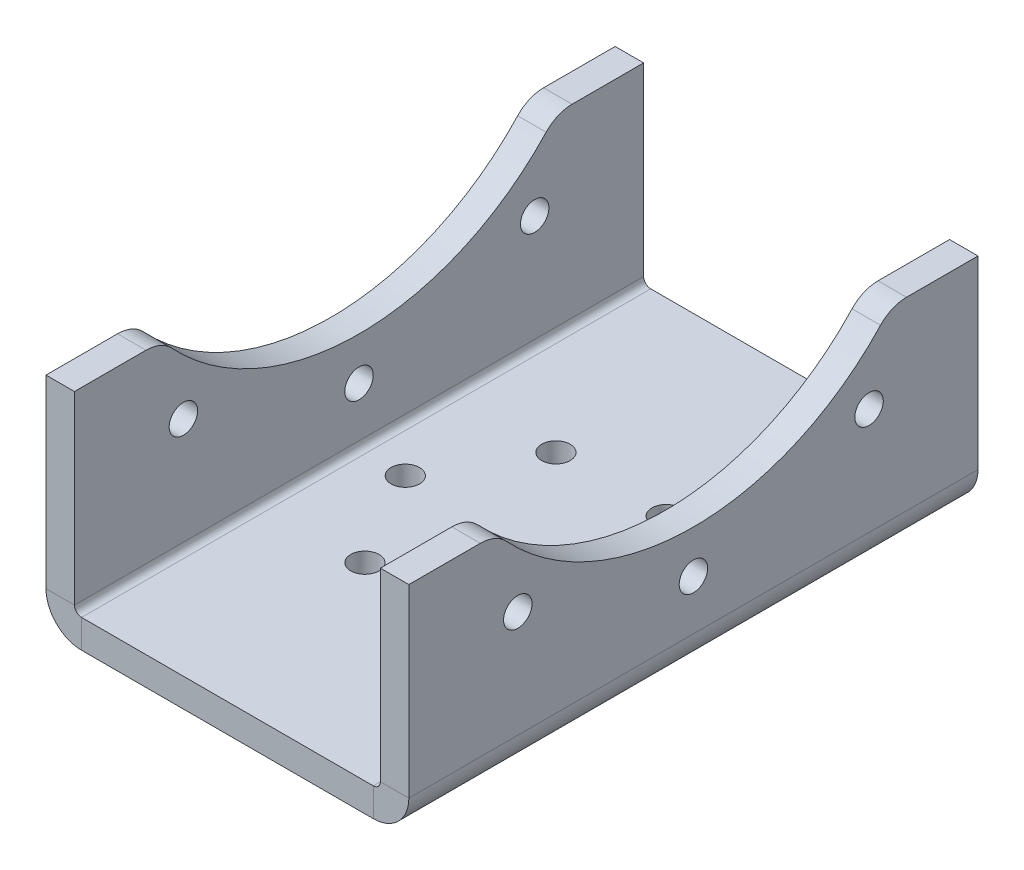
ISO-10303-21;
HEADER;
FILE_DESCRIPTION(('STEP AP214'),'2;1');
FILE_NAME('part.step','',(''),(''),'','','');
FILE_SCHEMA(('AUTOMOTIVE_DESIGN { 1 0 10303 214 1 1 1 1 }'));
ENDSEC;
DATA;
#1=APPLICATION_CONTEXT('core data for automotive mechanical design processes');
#2=APPLICATION_PROTOCOL_DEFINITION('international standard','automotive_design',2000,#1);
#3=PRODUCT_CONTEXT('',#1,'mechanical');
#4=PRODUCT('Part','Part','',(#3));
#5=PRODUCT_RELATED_PRODUCT_CATEGORY('part','',(#4));
#6=PRODUCT_DEFINITION_FORMATION('','',#4);
#7=PRODUCT_DEFINITION_CONTEXT('part definition',#1,'design');
#8=PRODUCT_DEFINITION('design','',#6,#7);
#9=PRODUCT_DEFINITION_SHAPE('','',#8);
#10=(LENGTH_UNIT() NAMED_UNIT(*) SI_UNIT(.MILLI.,.METRE.));
#11=(NAMED_UNIT(*) PLANE_ANGLE_UNIT() SI_UNIT($,.RADIAN.));
#12=(NAMED_UNIT(*) SI_UNIT($,.STERADIAN.) SOLID_ANGLE_UNIT());
#13=UNCERTAINTY_MEASURE_WITH_UNIT(LENGTH_MEASURE(1.E-05),#10,'distance_accuracy_value','');
#14=(GEOMETRIC_REPRESENTATION_CONTEXT(3) GLOBAL_UNCERTAINTY_ASSIGNED_CONTEXT((#13)) GLOBAL_UNIT_ASSIGNED_CONTEXT((#10,
#11,#12)) REPRESENTATION_CONTEXT('',''));
#15=CARTESIAN_POINT('',(0.,0.,0.));
#16=DIRECTION('',(0.,0.,1.));
#17=DIRECTION('',(1.,0.,0.));
#18=AXIS2_PLACEMENT_3D('',#15,#16,#17);
#19=CARTESIAN_POINT('',(-25.5,27.,80.));
#20=DIRECTION('',(0.,1.,0.));
#21=DIRECTION('',(0.,0.,1.));
#22=AXIS2_PLACEMENT_3D('',#19,#20,#21);
#23=PLANE('',#22);
#24=DIRECTION('',(0.,0.,-1.));
#25=VECTOR('',#24,1.);
#26=CARTESIAN_POINT('',(-25.5,27.,80.));
#27=LINE('',#26,#25);
#28=CARTESIAN_POINT('',(-25.5,27.,10.0500417362561));
#29=VERTEX_POINT('',#28);
#30=CARTESIAN_POINT('',(-25.5,27.,0.));
#31=VERTEX_POINT('',#30);
#32=EDGE_CURVE('E298',#29,#31,#27,.T.);
#33=ORIENTED_EDGE('',*,*,#32,.F.);
#34=DIRECTION('',(1.,0.,0.));
#35=VECTOR('',#34,1.);
#36=CARTESIAN_POINT('',(-21.5,27.,10.0500417362561));
#37=LINE('',#36,#35);
#38=CARTESIAN_POINT('',(-21.5,27.,10.0500417362561));
#39=VERTEX_POINT('',#38);
#40=EDGE_CURVE('E344',#29,#39,#37,.T.);
#41=ORIENTED_EDGE('',*,*,#40,.T.);
#42=DIRECTION('',(0.,0.,-1.));
#43=VECTOR('',#42,1.);
#44=CARTESIAN_POINT('',(-21.5,27.,80.));
#45=LINE('',#44,#43);
#46=CARTESIAN_POINT('',(-21.5,27.,0.));
#47=VERTEX_POINT('',#46);
#48=EDGE_CURVE('E196',#39,#47,#45,.T.);
#49=ORIENTED_EDGE('',*,*,#48,.T.);
#50=DIRECTION('',(1.,0.,0.));
#51=VECTOR('',#50,1.);
#52=CARTESIAN_POINT('',(-25.5,27.,0.));
#53=LINE('',#52,#51);
#54=EDGE_CURVE('E236',#31,#47,#53,.T.);
#55=ORIENTED_EDGE('',*,*,#54,.F.);
#56=EDGE_LOOP('',(#33,#41,#49,#55));
#57=FACE_BOUND('',#56,.T.);
#58=ADVANCED_FACE('F36',(#57),#23,.T.);
#59=CARTESIAN_POINT('',(21.5,27.,80.));
#60=DIRECTION('',(0.,1.,0.));
#61=DIRECTION('',(0.,0.,1.));
#62=AXIS2_PLACEMENT_3D('',#59,#60,#61);
#63=PLANE('',#62);
#64=DIRECTION('',(0.,0.,-1.));
#65=VECTOR('',#64,1.);
#66=CARTESIAN_POINT('',(21.5,27.,80.));
#67=LINE('',#66,#65);
#68=CARTESIAN_POINT('',(21.5,27.,10.0500417362561));
#69=VERTEX_POINT('',#68);
#70=CARTESIAN_POINT('',(21.5,27.,0.));
#71=VERTEX_POINT('',#70);
#72=EDGE_CURVE('E279',#69,#71,#67,.T.);
#73=ORIENTED_EDGE('',*,*,#72,.F.);
#74=DIRECTION('',(1.,0.,0.));
#75=VECTOR('',#74,1.);
#76=CARTESIAN_POINT('',(25.5,27.,10.0500417362561));
#77=LINE('',#76,#75);
#78=CARTESIAN_POINT('',(25.5,27.,10.0500417362561));
#79=VERTEX_POINT('',#78);
#80=EDGE_CURVE('E61',#69,#79,#77,.T.);
#81=ORIENTED_EDGE('',*,*,#80,.T.);
#82=DIRECTION('',(0.,0.,-1.));
#83=VECTOR('',#82,1.);
#84=CARTESIAN_POINT('',(25.5,27.,80.));
#85=LINE('',#84,#83);
#86=CARTESIAN_POINT('',(25.5,27.,0.));
#87=VERTEX_POINT('',#86);
#88=EDGE_CURVE('E283',#79,#87,#85,.T.);
#89=ORIENTED_EDGE('',*,*,#88,.T.);
#90=DIRECTION('',(1.,0.,0.));
#91=VECTOR('',#90,1.);
#92=CARTESIAN_POINT('',(21.5,27.,0.));
#93=LINE('',#92,#91);
#94=EDGE_CURVE('E255',#71,#87,#93,.T.);
#95=ORIENTED_EDGE('',*,*,#94,.F.);
#96=EDGE_LOOP('',(#73,#81,#89,#95));
#97=FACE_BOUND('',#96,.T.);
#98=ADVANCED_FACE('F426',(#97),#63,.T.);
#99=CARTESIAN_POINT('',(21.5,1.00000000000001,80.));
#100=DIRECTION('',(0.,0.,1.));
#101=DIRECTION('',(1.,0.,0.));
#102=AXIS2_PLACEMENT_3D('',#99,#100,#101);
#103=PLANE('',#102);
#104=DIRECTION('',(1.,0.,0.));
#105=VECTOR('',#104,1.);
#106=CARTESIAN_POINT('',(21.5,1.00000000000001,80.));
#107=LINE('',#106,#105);
#108=CARTESIAN_POINT('',(21.5,1.00000000000001,80.));
#109=VERTEX_POINT('',#108);
#110=CARTESIAN_POINT('',(25.5,1.00000000000001,80.));
#111=VERTEX_POINT('',#110);
#112=EDGE_CURVE('E312',#109,#111,#107,.T.);
#113=ORIENTED_EDGE('',*,*,#112,.F.);
#114=CARTESIAN_POINT('',(20.5,1.00000000000001,80.));
#115=DIRECTION('',(0.,0.,1.));
#116=DIRECTION('',(1.,0.,0.));
#117=AXIS2_PLACEMENT_3D('',#114,#115,#116);
#118=CIRCLE('',#117,1.);
#119=CARTESIAN_POINT('',(20.5,0.,80.));
#120=VERTEX_POINT('',#119);
#121=EDGE_CURVE('E224',#109,#120,#118,.F.);
#122=ORIENTED_EDGE('',*,*,#121,.T.);
#123=DIRECTION('',(0.,1.,0.));
#124=VECTOR('',#123,1.);
#125=CARTESIAN_POINT('',(20.5,-3.99999999999999,80.));
#126=LINE('',#125,#124);
#127=CARTESIAN_POINT('',(20.5,-3.99999999999999,80.));
#128=VERTEX_POINT('',#127);
#129=EDGE_CURVE('E310',#128,#120,#126,.T.);
#130=ORIENTED_EDGE('',*,*,#129,.F.);
#131=CARTESIAN_POINT('',(20.5,1.00000000000001,80.));
#132=DIRECTION('',(0.,0.,1.));
#133=DIRECTION('',(1.,0.,0.));
#134=AXIS2_PLACEMENT_3D('',#131,#132,#133);
#135=CIRCLE('',#134,5.);
#136=EDGE_CURVE('E212',#111,#128,#135,.F.);
#137=ORIENTED_EDGE('',*,*,#136,.F.);
#138=EDGE_LOOP('',(#113,#122,#130,#137));
#139=FACE_BOUND('',#138,.T.);
#140=ADVANCED_FACE('F432',(#139),#103,.T.);
#141=CARTESIAN_POINT('',(20.5,-3.99999999999999,80.));
#142=DIRECTION('',(0.,0.,1.));
#143=DIRECTION('',(1.,0.,0.));
#144=AXIS2_PLACEMENT_3D('',#141,#142,#143);
#145=PLANE('',#144);
#146=DIRECTION('',(0.,-1.,0.));
#147=VECTOR('',#146,1.);
#148=CARTESIAN_POINT('',(21.5,0.,80.));
#149=LINE('',#148,#147);
#150=CARTESIAN_POINT('',(21.5,27.,80.));
#151=VERTEX_POINT('',#150);
#152=EDGE_CURVE('E221',#151,#109,#149,.T.);
#153=ORIENTED_EDGE('',*,*,#152,.T.);
#154=ORIENTED_EDGE('',*,*,#112,.T.);
#155=DIRECTION('',(0.,1.,0.));
#156=VECTOR('',#155,1.);
#157=CARTESIAN_POINT('',(25.5,0.,80.));
#158=LINE('',#157,#156);
#159=CARTESIAN_POINT('',(25.5,27.,80.));
#160=VERTEX_POINT('',#159);
#161=EDGE_CURVE('E215',#160,#111,#158,.F.);
#162=ORIENTED_EDGE('',*,*,#161,.F.);
#163=DIRECTION('',(1.,0.,0.));
#164=VECTOR('',#163,1.);
#165=CARTESIAN_POINT('',(21.5,27.,80.));
#166=LINE('',#165,#164);
#167=EDGE_CURVE('E218',#151,#160,#166,.T.);
#168=ORIENTED_EDGE('',*,*,#167,.F.);
#169=EDGE_LOOP('',(#153,#154,#162,#168));
#170=FACE_BOUND('',#169,.T.);
#171=ADVANCED_FACE('F472',(#170),#145,.T.);
#172=CARTESIAN_POINT('',(20.5,0.,0.));
#173=DIRECTION('',(0.,0.,-1.));
#174=DIRECTION('',(-1.,0.,0.));
#175=AXIS2_PLACEMENT_3D('',#172,#173,#174);
#176=PLANE('',#175);
#177=DIRECTION('',(0.,-1.,0.));
#178=VECTOR('',#177,1.);
#179=CARTESIAN_POINT('',(20.5,0.,0.));
#180=LINE('',#179,#178);
#181=CARTESIAN_POINT('',(20.5,0.,0.));
#182=VERTEX_POINT('',#181);
#183=CARTESIAN_POINT('',(20.5,-3.99999999999999,0.));
#184=VERTEX_POINT('',#183);
#185=EDGE_CURVE('E308',#182,#184,#180,.T.);
#186=ORIENTED_EDGE('',*,*,#185,.F.);
#187=CARTESIAN_POINT('',(20.5,1.00000000000001,0.));
#188=DIRECTION('',(0.,0.,1.));
#189=DIRECTION('',(1.,0.,0.));
#190=AXIS2_PLACEMENT_3D('',#187,#188,#189);
#191=CIRCLE('',#190,1.);
#192=CARTESIAN_POINT('',(21.5,1.00000000000001,0.));
#193=VERTEX_POINT('',#192);
#194=EDGE_CURVE('E261',#193,#182,#191,.F.);
#195=ORIENTED_EDGE('',*,*,#194,.F.);
#196=DIRECTION('',(-1.,0.,0.));
#197=VECTOR('',#196,1.);
#198=CARTESIAN_POINT('',(25.5,1.00000000000001,0.));
#199=LINE('',#198,#197);
#200=CARTESIAN_POINT('',(25.5,1.00000000000001,0.));
#201=VERTEX_POINT('',#200);
#202=EDGE_CURVE('E306',#201,#193,#199,.T.);
#203=ORIENTED_EDGE('',*,*,#202,.F.);
#204=CARTESIAN_POINT('',(20.5,1.00000000000001,0.));
#205=DIRECTION('',(0.,0.,1.));
#206=DIRECTION('',(1.,0.,0.));
#207=AXIS2_PLACEMENT_3D('',#204,#205,#206);
#208=CIRCLE('',#207,5.);
#209=EDGE_CURVE('E249',#201,#184,#208,.F.);
#210=ORIENTED_EDGE('',*,*,#209,.T.);
#211=EDGE_LOOP('',(#186,#195,#203,#210));
#212=FACE_BOUND('',#211,.T.);
#213=ADVANCED_FACE('F468',(#212),#176,.T.);
#214=CARTESIAN_POINT('',(25.5,1.00000000000001,0.));
#215=DIRECTION('',(0.,0.,-1.));
#216=DIRECTION('',(-1.,0.,0.));
#217=AXIS2_PLACEMENT_3D('',#214,#215,#216);
#218=PLANE('',#217);
#219=DIRECTION('',(-1.,0.,0.));
#220=VECTOR('',#219,1.);
#221=CARTESIAN_POINT('',(-21.5,0.,0.));
#222=LINE('',#221,#220);
#223=CARTESIAN_POINT('',(-20.5,0.,0.));
#224=VERTEX_POINT('',#223);
#225=EDGE_CURVE('E264',#182,#224,#222,.T.);
#226=ORIENTED_EDGE('',*,*,#225,.F.);
#227=ORIENTED_EDGE('',*,*,#185,.T.);
#228=DIRECTION('',(-1.,0.,0.));
#229=VECTOR('',#228,1.);
#230=CARTESIAN_POINT('',(-21.5,-4.,0.));
#231=LINE('',#230,#229);
#232=CARTESIAN_POINT('',(-20.5,-4.,0.));
#233=VERTEX_POINT('',#232);
#234=EDGE_CURVE('E246',#184,#233,#231,.T.);
#235=ORIENTED_EDGE('',*,*,#234,.T.);
#236=DIRECTION('',(0.,1.,0.));
#237=VECTOR('',#236,1.);
#238=CARTESIAN_POINT('',(-20.5,-4.,0.));
#239=LINE('',#238,#237);
#240=EDGE_CURVE('E195',#233,#224,#239,.T.);
#241=ORIENTED_EDGE('',*,*,#240,.T.);
#242=EDGE_LOOP('',(#226,#227,#235,#241));
#243=FACE_BOUND('',#242,.T.);
#244=ADVANCED_FACE('F464',(#243),#218,.T.);
#245=CARTESIAN_POINT('',(-20.5,0.,80.));
#246=DIRECTION('',(0.,0.,1.));
#247=DIRECTION('',(1.,0.,0.));
#248=AXIS2_PLACEMENT_3D('',#245,#246,#247);
#249=PLANE('',#248);
#250=DIRECTION('',(0.,-1.,0.));
#251=VECTOR('',#250,1.);
#252=CARTESIAN_POINT('',(-20.5,0.,80.));
#253=LINE('',#252,#251);
#254=CARTESIAN_POINT('',(-20.5,0.,80.));
#255=VERTEX_POINT('',#254);
#256=CARTESIAN_POINT('',(-20.5,-4.,80.));
#257=VERTEX_POINT('',#256);
#258=EDGE_CURVE('E304',#255,#257,#253,.T.);
#259=ORIENTED_EDGE('',*,*,#258,.F.);
#260=CARTESIAN_POINT('',(-20.5,1.,80.));
#261=DIRECTION('',(0.,0.,1.));
#262=DIRECTION('',(1.,0.,0.));
#263=AXIS2_PLACEMENT_3D('',#260,#261,#262);
#264=CIRCLE('',#263,1.);
#265=CARTESIAN_POINT('',(-21.5,1.,80.));
#266=VERTEX_POINT('',#265);
#267=EDGE_CURVE('E230',#255,#266,#264,.F.);
#268=ORIENTED_EDGE('',*,*,#267,.T.);
#269=DIRECTION('',(1.,0.,0.));
#270=VECTOR('',#269,1.);
#271=CARTESIAN_POINT('',(-25.5,1.,80.));
#272=LINE('',#271,#270);
#273=CARTESIAN_POINT('',(-25.5,1.,80.));
#274=VERTEX_POINT('',#273);
#275=EDGE_CURVE('E182',#274,#266,#272,.T.);
#276=ORIENTED_EDGE('',*,*,#275,.F.);
#277=CARTESIAN_POINT('',(-20.5,1.,80.));
#278=DIRECTION('',(0.,0.,1.));
#279=DIRECTION('',(1.,0.,0.));
#280=AXIS2_PLACEMENT_3D('',#277,#278,#279);
#281=CIRCLE('',#280,5.);
#282=EDGE_CURVE('E203',#257,#274,#281,.F.);
#283=ORIENTED_EDGE('',*,*,#282,.F.);
#284=EDGE_LOOP('',(#259,#268,#276,#283));
#285=FACE_BOUND('',#284,.T.);
#286=ADVANCED_FACE('F460',(#285),#249,.T.);
#287=CARTESIAN_POINT('',(-25.5,1.,80.));
#288=DIRECTION('',(0.,0.,1.));
#289=DIRECTION('',(1.,0.,0.));
#290=AXIS2_PLACEMENT_3D('',#287,#288,#289);
#291=PLANE('',#290);
#292=DIRECTION('',(-1.,0.,0.));
#293=VECTOR('',#292,1.);
#294=CARTESIAN_POINT('',(-21.5,0.,80.));
#295=LINE('',#294,#293);
#296=EDGE_CURVE('E227',#120,#255,#295,.T.);
#297=ORIENTED_EDGE('',*,*,#296,.T.);
#298=ORIENTED_EDGE('',*,*,#258,.T.);
#299=DIRECTION('',(-1.,0.,0.));
#300=VECTOR('',#299,1.);
#301=CARTESIAN_POINT('',(-21.5,-4.,80.));
#302=LINE('',#301,#300);
#303=EDGE_CURVE('E209',#128,#257,#302,.T.);
#304=ORIENTED_EDGE('',*,*,#303,.F.);
#305=ORIENTED_EDGE('',*,*,#129,.T.);
#306=EDGE_LOOP('',(#297,#298,#304,#305));
#307=FACE_BOUND('',#306,.T.);
#308=ADVANCED_FACE('F456',(#307),#291,.T.);
#309=CARTESIAN_POINT('',(-21.5,1.,0.));
#310=DIRECTION('',(0.,0.,-1.));
#311=DIRECTION('',(-1.,0.,0.));
#312=AXIS2_PLACEMENT_3D('',#309,#310,#311);
#313=PLANE('',#312);
#314=DIRECTION('',(-1.,0.,0.));
#315=VECTOR('',#314,1.);
#316=CARTESIAN_POINT('',(-21.5,1.,0.));
#317=LINE('',#316,#315);
#318=CARTESIAN_POINT('',(-21.5,1.,0.));
#319=VERTEX_POINT('',#318);
#320=CARTESIAN_POINT('',(-25.5,1.,0.));
#321=VERTEX_POINT('',#320);
#322=EDGE_CURVE('E301',#319,#321,#317,.T.);
#323=ORIENTED_EDGE('',*,*,#322,.F.);
#324=CARTESIAN_POINT('',(-20.5,1.,0.));
#325=DIRECTION('',(0.,0.,1.));
#326=DIRECTION('',(1.,0.,0.));
#327=AXIS2_PLACEMENT_3D('',#324,#325,#326);
#328=CIRCLE('',#327,1.);
#329=EDGE_CURVE('E186',#224,#319,#328,.F.);
#330=ORIENTED_EDGE('',*,*,#329,.F.);
#331=ORIENTED_EDGE('',*,*,#240,.F.);
#332=CARTESIAN_POINT('',(-20.5,1.,0.));
#333=DIRECTION('',(0.,0.,1.));
#334=DIRECTION('',(1.,0.,0.));
#335=AXIS2_PLACEMENT_3D('',#332,#333,#334);
#336=CIRCLE('',#335,5.);
#337=EDGE_CURVE('E243',#233,#321,#336,.F.);
#338=ORIENTED_EDGE('',*,*,#337,.T.);
#339=EDGE_LOOP('',(#323,#330,#331,#338));
#340=FACE_BOUND('',#339,.T.);
#341=ADVANCED_FACE('F450',(#340),#313,.T.);
#342=CARTESIAN_POINT('',(-20.5,-4.,0.));
#343=DIRECTION('',(0.,0.,-1.));
#344=DIRECTION('',(-1.,0.,0.));
#345=AXIS2_PLACEMENT_3D('',#342,#343,#344);
#346=PLANE('',#345);
#347=DIRECTION('',(0.,1.,0.));
#348=VECTOR('',#347,1.);
#349=CARTESIAN_POINT('',(-21.5,0.,0.));
#350=LINE('',#349,#348);
#351=EDGE_CURVE('E233',#319,#47,#350,.T.);
#352=ORIENTED_EDGE('',*,*,#351,.F.);
#353=ORIENTED_EDGE('',*,*,#322,.T.);
#354=DIRECTION('',(0.,1.,0.));
#355=VECTOR('',#354,1.);
#356=CARTESIAN_POINT('',(-25.5,0.,0.));
#357=LINE('',#356,#355);
#358=EDGE_CURVE('E240',#321,#31,#357,.T.);
#359=ORIENTED_EDGE('',*,*,#358,.T.);
#360=ORIENTED_EDGE('',*,*,#54,.T.);
#361=EDGE_LOOP('',(#352,#353,#359,#360));
#362=FACE_BOUND('',#361,.T.);
#363=ADVANCED_FACE('F446',(#362),#346,.T.);
#364=CARTESIAN_POINT('',(-21.5,0.,80.));
#365=DIRECTION('',(-1.,0.,0.));
#366=DIRECTION('',(0.,0.,1.));
#367=AXIS2_PLACEMENT_3D('',#364,#365,#366);
#368=PLANE('',#367);
#369=CARTESIAN_POINT('',(-21.5,16.0212862362522,64.6869805962839));
#370=DIRECTION('',(-1.,0.,0.));
#371=DIRECTION('',(0.,0.,1.));
#372=AXIS2_PLACEMENT_3D('',#369,#370,#371);
#373=CIRCLE('',#372,2.);
#374=CARTESIAN_POINT('',(-21.5,16.0212862362522,66.6869805962839));
#375=VERTEX_POINT('',#374);
#376=EDGE_CURVE('E237',#375,#375,#373,.T.);
#377=ORIENTED_EDGE('',*,*,#376,.T.);
#378=EDGE_LOOP('',(#377));
#379=FACE_BOUND('',#378,.T.);
#380=CARTESIAN_POINT('',(-21.5,16.0212862362522,15.3130194037161));
#381=DIRECTION('',(-1.,0.,0.));
#382=DIRECTION('',(0.,0.,1.));
#383=AXIS2_PLACEMENT_3D('',#380,#381,#382);
#384=CIRCLE('',#383,2.00000000000002);
#385=CARTESIAN_POINT('',(-21.5,16.0212862362522,17.3130194037162));
#386=VERTEX_POINT('',#385);
#387=EDGE_CURVE('E326',#386,#386,#384,.T.);
#388=ORIENTED_EDGE('',*,*,#387,.T.);
#389=EDGE_LOOP('',(#388));
#390=FACE_BOUND('',#389,.T.);
#391=CARTESIAN_POINT('',(-21.5,8.,40.));
#392=DIRECTION('',(-1.,0.,0.));
#393=DIRECTION('',(0.,0.,1.));
#394=AXIS2_PLACEMENT_3D('',#391,#392,#393);
#395=CIRCLE('',#394,1.99999999999998);
#396=CARTESIAN_POINT('',(-21.5,8.,42.));
#397=VERTEX_POINT('',#396);
#398=EDGE_CURVE('E321',#397,#397,#395,.T.);
#399=ORIENTED_EDGE('',*,*,#398,.T.);
#400=EDGE_LOOP('',(#399));
#401=FACE_BOUND('',#400,.T.);
#402=CARTESIAN_POINT('',(-21.5,50.,40.));
#403=DIRECTION('',(-1.,0.,0.));
#404=DIRECTION('',(0.,0.,1.));
#405=AXIS2_PLACEMENT_3D('',#402,#403,#404);
#406=CIRCLE('',#405,36.);
#407=CARTESIAN_POINT('',(-21.5,25.4146341463415,13.702475670859));
#408=VERTEX_POINT('',#407);
#409=CARTESIAN_POINT('',(-21.5,25.4146341463415,66.297524329141));
#410=VERTEX_POINT('',#409);
#411=EDGE_CURVE('E322',#408,#410,#406,.T.);
#412=ORIENTED_EDGE('',*,*,#411,.T.);
#413=CARTESIAN_POINT('',(-21.5,22.,69.9499582637439));
#414=DIRECTION('',(-1.,0.,0.));
#415=DIRECTION('',(0.,0.,1.));
#416=AXIS2_PLACEMENT_3D('',#413,#414,#415);
#417=CIRCLE('',#416,5.);
#418=CARTESIAN_POINT('',(-21.5,27.,69.9499582637439));
#419=VERTEX_POINT('',#418);
#420=EDGE_CURVE('E192',#410,#419,#417,.F.);
#421=ORIENTED_EDGE('',*,*,#420,.T.);
#422=CARTESIAN_POINT('',(-21.5,27.,80.));
#423=VERTEX_POINT('',#422);
#424=EDGE_CURVE('E189',#423,#419,#45,.T.);
#425=ORIENTED_EDGE('',*,*,#424,.F.);
#426=DIRECTION('',(0.,1.,0.));
#427=VECTOR('',#426,1.);
#428=CARTESIAN_POINT('',(-21.5,0.,80.));
#429=LINE('',#428,#427);
#430=EDGE_CURVE('E175',#266,#423,#429,.T.);
#431=ORIENTED_EDGE('',*,*,#430,.F.);
#432=DIRECTION('',(0.,0.,-1.));
#433=VECTOR('',#432,1.);
#434=CARTESIAN_POINT('',(-21.5,1.,80.));
#435=LINE('',#434,#433);
#436=EDGE_CURVE('E232',#266,#319,#435,.T.);
#437=ORIENTED_EDGE('',*,*,#436,.T.);
#438=ORIENTED_EDGE('',*,*,#351,.T.);
#439=ORIENTED_EDGE('',*,*,#48,.F.);
#440=CARTESIAN_POINT('',(-21.5,22.,10.0500417362561));
#441=DIRECTION('',(-1.,0.,0.));
#442=DIRECTION('',(0.,0.,1.));
#443=AXIS2_PLACEMENT_3D('',#440,#441,#442);
#444=CIRCLE('',#443,5.);
#445=EDGE_CURVE('E335',#39,#408,#444,.F.);
#446=ORIENTED_EDGE('',*,*,#445,.T.);
#447=EDGE_LOOP('',(#412,#421,#425,#431,#437,#438,#439,#446));
#448=FACE_BOUND('',#447,.T.);
#449=ADVANCED_FACE('F191',(#379,#390,#401,#448),#368,.F.);
#450=ORIENTED_EDGE('',*,*,#424,.T.);
#451=DIRECTION('',(1.,0.,0.));
#452=VECTOR('',#451,1.);
#453=CARTESIAN_POINT('',(-25.5,27.,69.9499582637439));
#454=LINE('',#453,#452);
#455=CARTESIAN_POINT('',(-25.5,27.,69.9499582637439));
#456=VERTEX_POINT('',#455);
#457=EDGE_CURVE('E338',#419,#456,#454,.F.);
#458=ORIENTED_EDGE('',*,*,#457,.T.);
#459=CARTESIAN_POINT('',(-25.5,27.,80.));
#460=VERTEX_POINT('',#459);
#461=EDGE_CURVE('E200',#460,#456,#27,.T.);
#462=ORIENTED_EDGE('',*,*,#461,.F.);
#463=DIRECTION('',(1.,0.,0.));
#464=VECTOR('',#463,1.);
#465=CARTESIAN_POINT('',(-25.5,27.,80.));
#466=LINE('',#465,#464);
#467=EDGE_CURVE('E180',#460,#423,#466,.T.);
#468=ORIENTED_EDGE('',*,*,#467,.T.);
#469=EDGE_LOOP('',(#450,#458,#462,#468));
#470=FACE_BOUND('',#469,.T.);
#471=ADVANCED_FACE('F198',(#470),#23,.T.);
#472=CARTESIAN_POINT('',(-25.5,0.,80.));
#473=DIRECTION('',(-1.,0.,0.));
#474=DIRECTION('',(0.,0.,1.));
#475=AXIS2_PLACEMENT_3D('',#472,#473,#474);
#476=PLANE('',#475);
#477=CARTESIAN_POINT('',(-25.5,16.0212862362522,64.6869805962839));
#478=DIRECTION('',(-1.,0.,0.));
#479=DIRECTION('',(0.,0.,1.));
#480=AXIS2_PLACEMENT_3D('',#477,#478,#479);
#481=CIRCLE('',#480,2.);
#482=CARTESIAN_POINT('',(-25.5,16.0212862362522,66.6869805962839));
#483=VERTEX_POINT('',#482);
#484=EDGE_CURVE('E376',#483,#483,#481,.T.);
#485=ORIENTED_EDGE('',*,*,#484,.F.);
#486=EDGE_LOOP('',(#485));
#487=FACE_BOUND('',#486,.T.);
#488=CARTESIAN_POINT('',(-25.5,16.0212862362522,15.3130194037161));
#489=DIRECTION('',(-1.,0.,0.));
#490=DIRECTION('',(0.,0.,1.));
#491=AXIS2_PLACEMENT_3D('',#488,#489,#490);
#492=CIRCLE('',#491,2.00000000000002);
#493=CARTESIAN_POINT('',(-25.5,16.0212862362522,17.3130194037162));
#494=VERTEX_POINT('',#493);
#495=EDGE_CURVE('E385',#494,#494,#492,.T.);
#496=ORIENTED_EDGE('',*,*,#495,.F.);
#497=EDGE_LOOP('',(#496));
#498=FACE_BOUND('',#497,.T.);
#499=CARTESIAN_POINT('',(-25.5,8.,40.));
#500=DIRECTION('',(-1.,0.,0.));
#501=DIRECTION('',(0.,0.,1.));
#502=AXIS2_PLACEMENT_3D('',#499,#500,#501);
#503=CIRCLE('',#502,1.99999999999998);
#504=CARTESIAN_POINT('',(-25.5,8.,42.));
#505=VERTEX_POINT('',#504);
#506=EDGE_CURVE('E950',#505,#505,#503,.T.);
#507=ORIENTED_EDGE('',*,*,#506,.F.);
#508=EDGE_LOOP('',(#507));
#509=FACE_BOUND('',#508,.T.);
#510=ORIENTED_EDGE('',*,*,#461,.T.);
#511=CARTESIAN_POINT('',(-25.5,22.,69.9499582637439));
#512=DIRECTION('',(-1.,0.,0.));
#513=DIRECTION('',(0.,0.,1.));
#514=AXIS2_PLACEMENT_3D('',#511,#512,#513);
#515=CIRCLE('',#514,5.);
#516=CARTESIAN_POINT('',(-25.5,25.4146341463415,66.297524329141));
#517=VERTEX_POINT('',#516);
#518=EDGE_CURVE('E342',#456,#517,#515,.T.);
#519=ORIENTED_EDGE('',*,*,#518,.T.);
#520=CARTESIAN_POINT('',(-25.5,50.,40.));
#521=DIRECTION('',(-1.,0.,0.));
#522=DIRECTION('',(0.,0.,1.));
#523=AXIS2_PLACEMENT_3D('',#520,#521,#522);
#524=CIRCLE('',#523,36.);
#525=CARTESIAN_POINT('',(-25.5,25.4146341463415,13.702475670859));
#526=VERTEX_POINT('',#525);
#527=EDGE_CURVE('E391',#526,#517,#524,.T.);
#528=ORIENTED_EDGE('',*,*,#527,.F.);
#529=CARTESIAN_POINT('',(-25.5,22.,10.0500417362561));
#530=DIRECTION('',(-1.,0.,0.));
#531=DIRECTION('',(0.,0.,1.));
#532=AXIS2_PLACEMENT_3D('',#529,#530,#531);
#533=CIRCLE('',#532,5.);
#534=EDGE_CURVE('E340',#526,#29,#533,.T.);
#535=ORIENTED_EDGE('',*,*,#534,.T.);
#536=ORIENTED_EDGE('',*,*,#32,.T.);
#537=ORIENTED_EDGE('',*,*,#358,.F.);
#538=DIRECTION('',(0.,0.,-1.));
#539=VECTOR('',#538,1.);
#540=CARTESIAN_POINT('',(-25.5,1.,80.));
#541=LINE('',#540,#539);
#542=EDGE_CURVE('E295',#274,#321,#541,.T.);
#543=ORIENTED_EDGE('',*,*,#542,.F.);
#544=DIRECTION('',(0.,1.,0.));
#545=VECTOR('',#544,1.);
#546=CARTESIAN_POINT('',(-25.5,0.,80.));
#547=LINE('',#546,#545);
#548=EDGE_CURVE('E201',#274,#460,#547,.T.);
#549=ORIENTED_EDGE('',*,*,#548,.T.);
#550=EDGE_LOOP('',(#510,#519,#528,#535,#536,#537,#543,#549));
#551=FACE_BOUND('',#550,.T.);
#552=ADVANCED_FACE('F439',(#487,#498,#509,#551),#476,.T.);
#553=CARTESIAN_POINT('',(-20.5,1.,80.));
#554=DIRECTION('',(0.,0.,-1.));
#555=DIRECTION('',(-1.,0.,0.));
#556=AXIS2_PLACEMENT_3D('',#553,#554,#555);
#557=CYLINDRICAL_SURFACE('',#556,5.);
#558=ORIENTED_EDGE('',*,*,#337,.F.);
#559=DIRECTION('',(0.,0.,-1.));
#560=VECTOR('',#559,1.);
#561=CARTESIAN_POINT('',(-20.5,-4.,80.));
#562=LINE('',#561,#560);
#563=EDGE_CURVE('E292',#257,#233,#562,.T.);
#564=ORIENTED_EDGE('',*,*,#563,.F.);
#565=ORIENTED_EDGE('',*,*,#282,.T.);
#566=ORIENTED_EDGE('',*,*,#542,.T.);
#567=EDGE_LOOP('',(#558,#564,#565,#566));
#568=FACE_BOUND('',#567,.T.);
#569=ADVANCED_FACE('F444',(#568),#557,.T.);
#570=CARTESIAN_POINT('',(-21.5,-4.,80.));
#571=DIRECTION('',(0.,-1.,0.));
#572=DIRECTION('',(1.,0.,0.));
#573=AXIS2_PLACEMENT_3D('',#570,#571,#572);
#574=PLANE('',#573);
#575=CARTESIAN_POINT('',(16.,-3.99999999999999,40.));
#576=DIRECTION('',(0.,-1.,0.));
#577=DIRECTION('',(1.,0.,0.));
#578=AXIS2_PLACEMENT_3D('',#575,#576,#577);
#579=CIRCLE('',#578,2.);
#580=CARTESIAN_POINT('',(18.,-3.99999999999999,40.));
#581=VERTEX_POINT('',#580);
#582=EDGE_CURVE('E363',#581,#581,#579,.T.);
#583=ORIENTED_EDGE('',*,*,#582,.F.);
#584=EDGE_LOOP('',(#583));
#585=FACE_BOUND('',#584,.T.);
#586=CARTESIAN_POINT('',(-7.24999999999999,-4.,26.5766062413412));
#587=DIRECTION('',(0.,-1.,0.));
#588=DIRECTION('',(1.,0.,0.));
#589=AXIS2_PLACEMENT_3D('',#586,#587,#588);
#590=CIRCLE('',#589,2.);
#591=CARTESIAN_POINT('',(-5.24999999999999,-4.,26.5766062413412));
#592=VERTEX_POINT('',#591);
#593=EDGE_CURVE('E937',#592,#592,#590,.T.);
#594=ORIENTED_EDGE('',*,*,#593,.F.);
#595=EDGE_LOOP('',(#594));
#596=FACE_BOUND('',#595,.T.);
#597=CARTESIAN_POINT('',(8.24999999999998,-3.99999999999999,53.4233937586588));
#598=DIRECTION('',(0.,-1.,0.));
#599=DIRECTION('',(1.,0.,0.));
#600=AXIS2_PLACEMENT_3D('',#597,#598,#599);
#601=CIRCLE('',#600,2.);
#602=CARTESIAN_POINT('',(10.25,-3.99999999999999,53.4233937586588));
#603=VERTEX_POINT('',#602);
#604=EDGE_CURVE('E939',#603,#603,#601,.T.);
#605=ORIENTED_EDGE('',*,*,#604,.F.);
#606=EDGE_LOOP('',(#605));
#607=FACE_BOUND('',#606,.T.);
#608=CARTESIAN_POINT('',(-7.25000000000001,-4.,53.4233937586588));
#609=DIRECTION('',(0.,-1.,0.));
#610=DIRECTION('',(1.,0.,0.));
#611=AXIS2_PLACEMENT_3D('',#608,#609,#610);
#612=CIRCLE('',#611,2.);
#613=CARTESIAN_POINT('',(-5.25,-4.,53.4233937586588));
#614=VERTEX_POINT('',#613);
#615=EDGE_CURVE('E943',#614,#614,#612,.T.);
#616=ORIENTED_EDGE('',*,*,#615,.F.);
#617=EDGE_LOOP('',(#616));
#618=FACE_BOUND('',#617,.T.);
#619=CARTESIAN_POINT('',(-15.,-4.,40.));
#620=DIRECTION('',(0.,-1.,0.));
#621=DIRECTION('',(1.,0.,0.));
#622=AXIS2_PLACEMENT_3D('',#619,#620,#621);
#623=CIRCLE('',#622,2.);
#624=CARTESIAN_POINT('',(-13.,-4.,40.));
#625=VERTEX_POINT('',#624);
#626=EDGE_CURVE('E934',#625,#625,#623,.T.);
#627=ORIENTED_EDGE('',*,*,#626,.F.);
#628=EDGE_LOOP('',(#627));
#629=FACE_BOUND('',#628,.T.);
#630=CARTESIAN_POINT('',(8.25000000000001,-3.99999999999999,26.5766062413412));
#631=DIRECTION('',(0.,-1.,0.));
#632=DIRECTION('',(1.,0.,0.));
#633=AXIS2_PLACEMENT_3D('',#630,#631,#632);
#634=CIRCLE('',#633,2.);
#635=CARTESIAN_POINT('',(10.25,-3.99999999999999,26.5766062413412));
#636=VERTEX_POINT('',#635);
#637=EDGE_CURVE('E931',#636,#636,#634,.T.);
#638=ORIENTED_EDGE('',*,*,#637,.F.);
#639=EDGE_LOOP('',(#638));
#640=FACE_BOUND('',#639,.T.);
#641=ORIENTED_EDGE('',*,*,#234,.F.);
#642=DIRECTION('',(0.,0.,-1.));
#643=VECTOR('',#642,1.);
#644=CARTESIAN_POINT('',(20.5,-3.99999999999999,80.));
#645=LINE('',#644,#643);
#646=EDGE_CURVE('E289',#128,#184,#645,.T.);
#647=ORIENTED_EDGE('',*,*,#646,.F.);
#648=ORIENTED_EDGE('',*,*,#303,.T.);
#649=ORIENTED_EDGE('',*,*,#563,.T.);
#650=EDGE_LOOP('',(#641,#647,#648,#649));
#651=FACE_BOUND('',#650,.T.);
#652=ADVANCED_FACE('F586',(#585,#596,#607,#618,#629,#640,#651),#574,.T.);
#653=CARTESIAN_POINT('',(20.5,1.00000000000001,80.));
#654=DIRECTION('',(0.,0.,-1.));
#655=DIRECTION('',(-1.,0.,0.));
#656=AXIS2_PLACEMENT_3D('',#653,#654,#655);
#657=CYLINDRICAL_SURFACE('',#656,5.);
#658=ORIENTED_EDGE('',*,*,#209,.F.);
#659=DIRECTION('',(0.,0.,-1.));
#660=VECTOR('',#659,1.);
#661=CARTESIAN_POINT('',(25.5,1.00000000000001,80.));
#662=LINE('',#661,#660);
#663=EDGE_CURVE('E286',#111,#201,#662,.T.);
#664=ORIENTED_EDGE('',*,*,#663,.F.);
#665=ORIENTED_EDGE('',*,*,#136,.T.);
#666=ORIENTED_EDGE('',*,*,#646,.T.);
#667=EDGE_LOOP('',(#658,#664,#665,#666));
#668=FACE_BOUND('',#667,.T.);
#669=ADVANCED_FACE('F513',(#668),#657,.T.);
#670=CARTESIAN_POINT('',(25.5,0.,80.));
#671=DIRECTION('',(1.,0.,0.));
#672=DIRECTION('',(0.,0.,-1.));
#673=AXIS2_PLACEMENT_3D('',#670,#671,#672);
#674=PLANE('',#673);
#675=CARTESIAN_POINT('',(25.5,16.0212862362522,64.6869805962839));
#676=DIRECTION('',(-1.,0.,0.));
#677=DIRECTION('',(0.,0.,1.));
#678=AXIS2_PLACEMENT_3D('',#675,#676,#677);
#679=CIRCLE('',#678,2.);
#680=CARTESIAN_POINT('',(25.5,16.0212862362522,66.6869805962839));
#681=VERTEX_POINT('',#680);
#682=EDGE_CURVE('E380',#681,#681,#679,.T.);
#683=ORIENTED_EDGE('',*,*,#682,.T.);
#684=EDGE_LOOP('',(#683));
#685=FACE_BOUND('',#684,.T.);
#686=CARTESIAN_POINT('',(25.5,16.0212862362522,15.3130194037161));
#687=DIRECTION('',(-1.,0.,0.));
#688=DIRECTION('',(0.,0.,1.));
#689=AXIS2_PLACEMENT_3D('',#686,#687,#688);
#690=CIRCLE('',#689,2.00000000000002);
#691=CARTESIAN_POINT('',(25.5,16.0212862362522,17.3130194037162));
#692=VERTEX_POINT('',#691);
#693=EDGE_CURVE('E953',#692,#692,#690,.T.);
#694=ORIENTED_EDGE('',*,*,#693,.T.);
#695=EDGE_LOOP('',(#694));
#696=FACE_BOUND('',#695,.T.);
#697=CARTESIAN_POINT('',(25.5,8.,40.));
#698=DIRECTION('',(-1.,0.,0.));
#699=DIRECTION('',(0.,0.,1.));
#700=AXIS2_PLACEMENT_3D('',#697,#698,#699);
#701=CIRCLE('',#700,1.99999999999998);
#702=CARTESIAN_POINT('',(25.5,8.,42.));
#703=VERTEX_POINT('',#702);
#704=EDGE_CURVE('E394',#703,#703,#701,.T.);
#705=ORIENTED_EDGE('',*,*,#704,.T.);
#706=EDGE_LOOP('',(#705));
#707=FACE_BOUND('',#706,.T.);
#708=ORIENTED_EDGE('',*,*,#88,.F.);
#709=CARTESIAN_POINT('',(25.5,22.,10.0500417362561));
#710=DIRECTION('',(1.,0.,0.));
#711=DIRECTION('',(0.,0.,-1.));
#712=AXIS2_PLACEMENT_3D('',#709,#710,#711);
#713=CIRCLE('',#712,5.);
#714=CARTESIAN_POINT('',(25.5,25.4146341463415,13.702475670859));
#715=VERTEX_POINT('',#714);
#716=EDGE_CURVE('E45',#79,#715,#713,.T.);
#717=ORIENTED_EDGE('',*,*,#716,.T.);
#718=CARTESIAN_POINT('',(25.5,50.,40.));
#719=DIRECTION('',(-1.,0.,0.));
#720=DIRECTION('',(0.,0.,1.));
#721=AXIS2_PLACEMENT_3D('',#718,#719,#720);
#722=CIRCLE('',#721,36.);
#723=CARTESIAN_POINT('',(25.5,25.4146341463415,66.297524329141));
#724=VERTEX_POINT('',#723);
#725=EDGE_CURVE('E389',#715,#724,#722,.T.);
#726=ORIENTED_EDGE('',*,*,#725,.T.);
#727=CARTESIAN_POINT('',(25.5,22.,69.9499582637439));
#728=DIRECTION('',(1.,0.,0.));
#729=DIRECTION('',(0.,0.,-1.));
#730=AXIS2_PLACEMENT_3D('',#727,#728,#729);
#731=CIRCLE('',#730,5.);
#732=CARTESIAN_POINT('',(25.5,27.,69.9499582637439));
#733=VERTEX_POINT('',#732);
#734=EDGE_CURVE('E53',#724,#733,#731,.T.);
#735=ORIENTED_EDGE('',*,*,#734,.T.);
#736=EDGE_CURVE('E284',#160,#733,#85,.T.);
#737=ORIENTED_EDGE('',*,*,#736,.F.);
#738=ORIENTED_EDGE('',*,*,#161,.T.);
#739=ORIENTED_EDGE('',*,*,#663,.T.);
#740=DIRECTION('',(0.,1.,0.));
#741=VECTOR('',#740,1.);
#742=CARTESIAN_POINT('',(25.5,0.,0.));
#743=LINE('',#742,#741);
#744=EDGE_CURVE('E252',#87,#201,#743,.F.);
#745=ORIENTED_EDGE('',*,*,#744,.F.);
#746=EDGE_LOOP('',(#708,#717,#726,#735,#737,#738,#739,#745));
#747=FACE_BOUND('',#746,.T.);
#748=ADVANCED_FACE('F493',(#685,#696,#707,#747),#674,.T.);
#749=ORIENTED_EDGE('',*,*,#736,.T.);
#750=DIRECTION('',(1.,0.,0.));
#751=VECTOR('',#750,1.);
#752=CARTESIAN_POINT('',(21.5,27.,69.9499582637439));
#753=LINE('',#752,#751);
#754=CARTESIAN_POINT('',(21.5,27.,69.9499582637439));
#755=VERTEX_POINT('',#754);
#756=EDGE_CURVE('E11',#733,#755,#753,.F.);
#757=ORIENTED_EDGE('',*,*,#756,.T.);
#758=EDGE_CURVE('E280',#151,#755,#67,.T.);
#759=ORIENTED_EDGE('',*,*,#758,.F.);
#760=ORIENTED_EDGE('',*,*,#167,.T.);
#761=EDGE_LOOP('',(#749,#757,#759,#760));
#762=FACE_BOUND('',#761,.T.);
#763=ADVANCED_FACE('F434',(#762),#63,.T.);
#764=CARTESIAN_POINT('',(21.5,0.,80.));
#765=DIRECTION('',(1.,0.,0.));
#766=DIRECTION('',(0.,0.,-1.));
#767=AXIS2_PLACEMENT_3D('',#764,#765,#766);
#768=PLANE('',#767);
#769=CARTESIAN_POINT('',(21.5,16.0212862362522,64.6869805962839));
#770=DIRECTION('',(1.,0.,0.));
#771=DIRECTION('',(0.,0.,-1.));
#772=AXIS2_PLACEMENT_3D('',#769,#770,#771);
#773=CIRCLE('',#772,2.);
#774=CARTESIAN_POINT('',(21.5,16.0212862362522,62.6869805962839));
#775=VERTEX_POINT('',#774);
#776=EDGE_CURVE('E327',#775,#775,#773,.T.);
#777=ORIENTED_EDGE('',*,*,#776,.T.);
#778=EDGE_LOOP('',(#777));
#779=FACE_BOUND('',#778,.T.);
#780=CARTESIAN_POINT('',(21.5,16.0212862362522,15.3130194037161));
#781=DIRECTION('',(1.,0.,0.));
#782=DIRECTION('',(0.,0.,-1.));
#783=AXIS2_PLACEMENT_3D('',#780,#781,#782);
#784=CIRCLE('',#783,2.00000000000002);
#785=CARTESIAN_POINT('',(21.5,16.0212862362522,13.3130194037161));
#786=VERTEX_POINT('',#785);
#787=EDGE_CURVE('E323',#786,#786,#784,.T.);
#788=ORIENTED_EDGE('',*,*,#787,.T.);
#789=EDGE_LOOP('',(#788));
#790=FACE_BOUND('',#789,.T.);
#791=CARTESIAN_POINT('',(21.5,8.,40.));
#792=DIRECTION('',(1.,0.,0.));
#793=DIRECTION('',(0.,0.,-1.));
#794=AXIS2_PLACEMENT_3D('',#791,#792,#793);
#795=CIRCLE('',#794,1.99999999999998);
#796=CARTESIAN_POINT('',(21.5,8.,38.));
#797=VERTEX_POINT('',#796);
#798=EDGE_CURVE('E318',#797,#797,#795,.T.);
#799=ORIENTED_EDGE('',*,*,#798,.T.);
#800=EDGE_LOOP('',(#799));
#801=FACE_BOUND('',#800,.T.);
#802=CARTESIAN_POINT('',(21.5,50.,40.));
#803=DIRECTION('',(1.,0.,0.));
#804=DIRECTION('',(0.,0.,-1.));
#805=AXIS2_PLACEMENT_3D('',#802,#803,#804);
#806=CIRCLE('',#805,36.);
#807=CARTESIAN_POINT('',(21.5,25.4146341463415,66.297524329141));
#808=VERTEX_POINT('',#807);
#809=CARTESIAN_POINT('',(21.5,25.4146341463415,13.702475670859));
#810=VERTEX_POINT('',#809);
#811=EDGE_CURVE('E314',#808,#810,#806,.T.);
#812=ORIENTED_EDGE('',*,*,#811,.T.);
#813=CARTESIAN_POINT('',(21.5,22.,10.0500417362561));
#814=DIRECTION('',(1.,0.,0.));
#815=DIRECTION('',(0.,0.,-1.));
#816=AXIS2_PLACEMENT_3D('',#813,#814,#815);
#817=CIRCLE('',#816,5.);
#818=EDGE_CURVE('E354',#810,#69,#817,.F.);
#819=ORIENTED_EDGE('',*,*,#818,.T.);
#820=ORIENTED_EDGE('',*,*,#72,.T.);
#821=DIRECTION('',(0.,-1.,0.));
#822=VECTOR('',#821,1.);
#823=CARTESIAN_POINT('',(21.5,0.,0.));
#824=LINE('',#823,#822);
#825=EDGE_CURVE('E258',#71,#193,#824,.T.);
#826=ORIENTED_EDGE('',*,*,#825,.T.);
#827=DIRECTION('',(0.,0.,-1.));
#828=VECTOR('',#827,1.);
#829=CARTESIAN_POINT('',(21.5,1.00000000000001,80.));
#830=LINE('',#829,#828);
#831=EDGE_CURVE('E276',#109,#193,#830,.T.);
#832=ORIENTED_EDGE('',*,*,#831,.F.);
#833=ORIENTED_EDGE('',*,*,#152,.F.);
#834=ORIENTED_EDGE('',*,*,#758,.T.);
#835=CARTESIAN_POINT('',(21.5,22.,69.9499582637439));
#836=DIRECTION('',(1.,0.,0.));
#837=DIRECTION('',(0.,0.,-1.));
#838=AXIS2_PLACEMENT_3D('',#835,#836,#837);
#839=CIRCLE('',#838,5.);
#840=EDGE_CURVE('E352',#755,#808,#839,.F.);
#841=ORIENTED_EDGE('',*,*,#840,.T.);
#842=EDGE_LOOP('',(#812,#819,#820,#826,#832,#833,#834,#841));
#843=FACE_BOUND('',#842,.T.);
#844=ADVANCED_FACE('F504',(#779,#790,#801,#843),#768,.F.);
#845=CARTESIAN_POINT('',(20.5,1.00000000000001,80.));
#846=DIRECTION('',(0.,0.,-1.));
#847=DIRECTION('',(-1.,0.,0.));
#848=AXIS2_PLACEMENT_3D('',#845,#846,#847);
#849=CYLINDRICAL_SURFACE('',#848,1.);
#850=ORIENTED_EDGE('',*,*,#194,.T.);
#851=DIRECTION('',(0.,0.,-1.));
#852=VECTOR('',#851,1.);
#853=CARTESIAN_POINT('',(20.5,0.,80.));
#854=LINE('',#853,#852);
#855=EDGE_CURVE('E273',#120,#182,#854,.T.);
#856=ORIENTED_EDGE('',*,*,#855,.F.);
#857=ORIENTED_EDGE('',*,*,#121,.F.);
#858=ORIENTED_EDGE('',*,*,#831,.T.);
#859=EDGE_LOOP('',(#850,#856,#857,#858));
#860=FACE_BOUND('',#859,.T.);
#861=ADVANCED_FACE('F522',(#860),#849,.F.);
#862=CARTESIAN_POINT('',(-21.5,0.,80.));
#863=DIRECTION('',(0.,-1.,0.));
#864=DIRECTION('',(1.,0.,0.));
#865=AXIS2_PLACEMENT_3D('',#862,#863,#864);
#866=PLANE('',#865);
#867=CARTESIAN_POINT('',(16.,0.,40.));
#868=DIRECTION('',(0.,-1.,0.));
#869=DIRECTION('',(1.,0.,0.));
#870=AXIS2_PLACEMENT_3D('',#867,#868,#869);
#871=CIRCLE('',#870,2.);
#872=CARTESIAN_POINT('',(18.,0.,40.));
#873=VERTEX_POINT('',#872);
#874=EDGE_CURVE('E40',#873,#873,#871,.T.);
#875=ORIENTED_EDGE('',*,*,#874,.T.);
#876=EDGE_LOOP('',(#875));
#877=FACE_BOUND('',#876,.T.);
#878=CARTESIAN_POINT('',(-7.24999999999999,0.,26.5766062413412));
#879=DIRECTION('',(0.,-1.,0.));
#880=DIRECTION('',(1.,0.,0.));
#881=AXIS2_PLACEMENT_3D('',#878,#879,#880);
#882=CIRCLE('',#881,2.);
#883=CARTESIAN_POINT('',(-5.24999999999999,0.,26.5766062413412));
#884=VERTEX_POINT('',#883);
#885=EDGE_CURVE('E371',#884,#884,#882,.T.);
#886=ORIENTED_EDGE('',*,*,#885,.T.);
#887=EDGE_LOOP('',(#886));
#888=FACE_BOUND('',#887,.T.);
#889=CARTESIAN_POINT('',(8.24999999999998,0.,53.4233937586588));
#890=DIRECTION('',(0.,-1.,0.));
#891=DIRECTION('',(1.,0.,0.));
#892=AXIS2_PLACEMENT_3D('',#889,#890,#891);
#893=CIRCLE('',#892,2.);
#894=CARTESIAN_POINT('',(10.25,0.,53.4233937586588));
#895=VERTEX_POINT('',#894);
#896=EDGE_CURVE('E369',#895,#895,#893,.T.);
#897=ORIENTED_EDGE('',*,*,#896,.T.);
#898=EDGE_LOOP('',(#897));
#899=FACE_BOUND('',#898,.T.);
#900=CARTESIAN_POINT('',(-7.25000000000001,0.,53.4233937586588));
#901=DIRECTION('',(0.,-1.,0.));
#902=DIRECTION('',(1.,0.,0.));
#903=AXIS2_PLACEMENT_3D('',#900,#901,#902);
#904=CIRCLE('',#903,2.);
#905=CARTESIAN_POINT('',(-5.25000000000001,0.,53.4233937586588));
#906=VERTEX_POINT('',#905);
#907=EDGE_CURVE('E366',#906,#906,#904,.T.);
#908=ORIENTED_EDGE('',*,*,#907,.T.);
#909=EDGE_LOOP('',(#908));
#910=FACE_BOUND('',#909,.T.);
#911=CARTESIAN_POINT('',(-15.,0.,40.));
#912=DIRECTION('',(0.,-1.,0.));
#913=DIRECTION('',(1.,0.,0.));
#914=AXIS2_PLACEMENT_3D('',#911,#912,#913);
#915=CIRCLE('',#914,2.);
#916=CARTESIAN_POINT('',(-13.,0.,40.));
#917=VERTEX_POINT('',#916);
#918=EDGE_CURVE('E362',#917,#917,#915,.T.);
#919=ORIENTED_EDGE('',*,*,#918,.T.);
#920=EDGE_LOOP('',(#919));
#921=FACE_BOUND('',#920,.T.);
#922=CARTESIAN_POINT('',(8.25000000000001,0.,26.5766062413412));
#923=DIRECTION('',(0.,-1.,0.));
#924=DIRECTION('',(1.,0.,0.));
#925=AXIS2_PLACEMENT_3D('',#922,#923,#924);
#926=CIRCLE('',#925,2.);
#927=CARTESIAN_POINT('',(10.25,0.,26.5766062413412));
#928=VERTEX_POINT('',#927);
#929=EDGE_CURVE('E359',#928,#928,#926,.T.);
#930=ORIENTED_EDGE('',*,*,#929,.T.);
#931=EDGE_LOOP('',(#930));
#932=FACE_BOUND('',#931,.T.);
#933=ORIENTED_EDGE('',*,*,#225,.T.);
#934=DIRECTION('',(0.,0.,-1.));
#935=VECTOR('',#934,1.);
#936=CARTESIAN_POINT('',(-20.5,0.,80.));
#937=LINE('',#936,#935);
#938=EDGE_CURVE('E270',#255,#224,#937,.T.);
#939=ORIENTED_EDGE('',*,*,#938,.F.);
#940=ORIENTED_EDGE('',*,*,#296,.F.);
#941=ORIENTED_EDGE('',*,*,#855,.T.);
#942=EDGE_LOOP('',(#933,#939,#940,#941));
#943=FACE_BOUND('',#942,.T.);
#944=ADVANCED_FACE('F527',(#877,#888,#899,#910,#921,#932,#943),#866,.F.);
#945=CARTESIAN_POINT('',(-20.5,1.,80.));
#946=DIRECTION('',(0.,0.,-1.));
#947=DIRECTION('',(-1.,0.,0.));
#948=AXIS2_PLACEMENT_3D('',#945,#946,#947);
#949=CYLINDRICAL_SURFACE('',#948,1.);
#950=ORIENTED_EDGE('',*,*,#329,.T.);
#951=ORIENTED_EDGE('',*,*,#436,.F.);
#952=ORIENTED_EDGE('',*,*,#267,.F.);
#953=ORIENTED_EDGE('',*,*,#938,.T.);
#954=EDGE_LOOP('',(#950,#951,#952,#953));
#955=FACE_BOUND('',#954,.T.);
#956=ADVANCED_FACE('F532',(#955),#949,.F.);
#957=CARTESIAN_POINT('',(-20.5,1.,80.));
#958=DIRECTION('',(0.,0.,1.));
#959=DIRECTION('',(1.,0.,0.));
#960=AXIS2_PLACEMENT_3D('',#957,#958,#959);
#961=PLANE('',#960);
#962=ORIENTED_EDGE('',*,*,#430,.T.);
#963=ORIENTED_EDGE('',*,*,#467,.F.);
#964=ORIENTED_EDGE('',*,*,#548,.F.);
#965=ORIENTED_EDGE('',*,*,#275,.T.);
#966=EDGE_LOOP('',(#962,#963,#964,#965));
#967=FACE_BOUND('',#966,.T.);
#968=ADVANCED_FACE('F177',(#967),#961,.T.);
#969=CARTESIAN_POINT('',(-20.5,1.,0.));
#970=DIRECTION('',(0.,0.,1.));
#971=DIRECTION('',(1.,0.,0.));
#972=AXIS2_PLACEMENT_3D('',#969,#970,#971);
#973=PLANE('',#972);
#974=ORIENTED_EDGE('',*,*,#744,.T.);
#975=ORIENTED_EDGE('',*,*,#202,.T.);
#976=ORIENTED_EDGE('',*,*,#825,.F.);
#977=ORIENTED_EDGE('',*,*,#94,.T.);
#978=EDGE_LOOP('',(#974,#975,#976,#977));
#979=FACE_BOUND('',#978,.T.);
#980=ADVANCED_FACE('F517',(#979),#973,.F.);
#981=CARTESIAN_POINT('',(25.5,50.,40.));
#982=DIRECTION('',(-1.,0.,0.));
#983=DIRECTION('',(0.,0.,1.));
#984=AXIS2_PLACEMENT_3D('',#981,#982,#983);
#985=CYLINDRICAL_SURFACE('',#984,36.);
#986=ORIENTED_EDGE('',*,*,#725,.F.);
#987=DIRECTION('',(-1.,0.,0.));
#988=VECTOR('',#987,1.);
#989=CARTESIAN_POINT('',(25.5,25.4146341463415,13.702475670859));
#990=LINE('',#989,#988);
#991=EDGE_CURVE('E349',#715,#810,#990,.T.);
#992=ORIENTED_EDGE('',*,*,#991,.T.);
#993=ORIENTED_EDGE('',*,*,#811,.F.);
#994=DIRECTION('',(-1.,0.,0.));
#995=VECTOR('',#994,1.);
#996=CARTESIAN_POINT('',(25.5,25.4146341463415,66.297524329141));
#997=LINE('',#996,#995);
#998=EDGE_CURVE('E346',#808,#724,#997,.F.);
#999=ORIENTED_EDGE('',*,*,#998,.T.);
#1000=EDGE_LOOP('',(#986,#992,#993,#999));
#1001=FACE_BOUND('',#1000,.T.);
#1002=ADVANCED_FACE('F496',(#1001),#985,.F.);
#1003=CARTESIAN_POINT('',(25.5,8.,40.));
#1004=DIRECTION('',(-1.,0.,0.));
#1005=DIRECTION('',(0.,0.,1.));
#1006=AXIS2_PLACEMENT_3D('',#1003,#1004,#1005);
#1007=CYLINDRICAL_SURFACE('',#1006,1.99999999999998);
#1008=ORIENTED_EDGE('',*,*,#704,.F.);
#1009=EDGE_LOOP('',(#1008));
#1010=FACE_BOUND('',#1009,.T.);
#1011=ORIENTED_EDGE('',*,*,#798,.F.);
#1012=EDGE_LOOP('',(#1011));
#1013=FACE_BOUND('',#1012,.T.);
#1014=ADVANCED_FACE('F558',(#1010,#1013),#1007,.F.);
#1015=CARTESIAN_POINT('',(25.5,16.0212862362522,15.3130194037161));
#1016=DIRECTION('',(-1.,0.,0.));
#1017=DIRECTION('',(0.,0.,1.));
#1018=AXIS2_PLACEMENT_3D('',#1015,#1016,#1017);
#1019=CYLINDRICAL_SURFACE('',#1018,2.00000000000002);
#1020=ORIENTED_EDGE('',*,*,#693,.F.);
#1021=EDGE_LOOP('',(#1020));
#1022=FACE_BOUND('',#1021,.T.);
#1023=ORIENTED_EDGE('',*,*,#787,.F.);
#1024=EDGE_LOOP('',(#1023));
#1025=FACE_BOUND('',#1024,.T.);
#1026=ADVANCED_FACE('F420',(#1022,#1025),#1019,.F.);
#1027=CARTESIAN_POINT('',(25.5,16.0212862362522,64.6869805962839));
#1028=DIRECTION('',(-1.,0.,0.));
#1029=DIRECTION('',(0.,0.,1.));
#1030=AXIS2_PLACEMENT_3D('',#1027,#1028,#1029);
#1031=CYLINDRICAL_SURFACE('',#1030,2.);
#1032=ORIENTED_EDGE('',*,*,#682,.F.);
#1033=EDGE_LOOP('',(#1032));
#1034=FACE_BOUND('',#1033,.T.);
#1035=ORIENTED_EDGE('',*,*,#776,.F.);
#1036=EDGE_LOOP('',(#1035));
#1037=FACE_BOUND('',#1036,.T.);
#1038=ADVANCED_FACE('F409',(#1034,#1037),#1031,.F.);
#1039=ORIENTED_EDGE('',*,*,#527,.T.);
#1040=DIRECTION('',(-1.,0.,0.));
#1041=VECTOR('',#1040,1.);
#1042=CARTESIAN_POINT('',(25.5,25.4146341463415,66.297524329141));
#1043=LINE('',#1042,#1041);
#1044=EDGE_CURVE('E332',#517,#410,#1043,.F.);
#1045=ORIENTED_EDGE('',*,*,#1044,.T.);
#1046=ORIENTED_EDGE('',*,*,#411,.F.);
#1047=DIRECTION('',(-1.,0.,0.));
#1048=VECTOR('',#1047,1.);
#1049=CARTESIAN_POINT('',(25.5,25.4146341463415,13.702475670859));
#1050=LINE('',#1049,#1048);
#1051=EDGE_CURVE('E317',#408,#526,#1050,.T.);
#1052=ORIENTED_EDGE('',*,*,#1051,.T.);
#1053=EDGE_LOOP('',(#1039,#1045,#1046,#1052));
#1054=FACE_BOUND('',#1053,.T.);
#1055=ADVANCED_FACE('F423',(#1054),#985,.F.);
#1056=ORIENTED_EDGE('',*,*,#506,.T.);
#1057=EDGE_LOOP('',(#1056));
#1058=FACE_BOUND('',#1057,.T.);
#1059=ORIENTED_EDGE('',*,*,#398,.F.);
#1060=EDGE_LOOP('',(#1059));
#1061=FACE_BOUND('',#1060,.T.);
#1062=ADVANCED_FACE('F417',(#1058,#1061),#1007,.F.);
#1063=ORIENTED_EDGE('',*,*,#495,.T.);
#1064=EDGE_LOOP('',(#1063));
#1065=FACE_BOUND('',#1064,.T.);
#1066=ORIENTED_EDGE('',*,*,#387,.F.);
#1067=EDGE_LOOP('',(#1066));
#1068=FACE_BOUND('',#1067,.T.);
#1069=ADVANCED_FACE('F407',(#1065,#1068),#1019,.F.);
#1070=ORIENTED_EDGE('',*,*,#484,.T.);
#1071=EDGE_LOOP('',(#1070));
#1072=FACE_BOUND('',#1071,.T.);
#1073=ORIENTED_EDGE('',*,*,#376,.F.);
#1074=EDGE_LOOP('',(#1073));
#1075=FACE_BOUND('',#1074,.T.);
#1076=ADVANCED_FACE('F404',(#1072,#1075),#1031,.F.);
#1077=CARTESIAN_POINT('',(25.5,22.,69.9499582637439));
#1078=DIRECTION('',(-1.,0.,0.));
#1079=DIRECTION('',(0.,0.,1.));
#1080=AXIS2_PLACEMENT_3D('',#1077,#1078,#1079);
#1081=CYLINDRICAL_SURFACE('',#1080,5.);
#1082=ORIENTED_EDGE('',*,*,#518,.F.);
#1083=ORIENTED_EDGE('',*,*,#457,.F.);
#1084=ORIENTED_EDGE('',*,*,#420,.F.);
#1085=ORIENTED_EDGE('',*,*,#1044,.F.);
#1086=EDGE_LOOP('',(#1082,#1083,#1084,#1085));
#1087=FACE_BOUND('',#1086,.T.);
#1088=ADVANCED_FACE('F406',(#1087),#1081,.T.);
#1089=CARTESIAN_POINT('',(25.5,22.,10.0500417362561));
#1090=DIRECTION('',(-1.,0.,0.));
#1091=DIRECTION('',(0.,0.,1.));
#1092=AXIS2_PLACEMENT_3D('',#1089,#1090,#1091);
#1093=CYLINDRICAL_SURFACE('',#1092,5.);
#1094=ORIENTED_EDGE('',*,*,#445,.F.);
#1095=ORIENTED_EDGE('',*,*,#40,.F.);
#1096=ORIENTED_EDGE('',*,*,#534,.F.);
#1097=ORIENTED_EDGE('',*,*,#1051,.F.);
#1098=EDGE_LOOP('',(#1094,#1095,#1096,#1097));
#1099=FACE_BOUND('',#1098,.T.);
#1100=ADVANCED_FACE('F414',(#1099),#1093,.T.);
#1101=CARTESIAN_POINT('',(25.5,22.,10.0500417362561));
#1102=DIRECTION('',(-1.,0.,0.));
#1103=DIRECTION('',(0.,0.,1.));
#1104=AXIS2_PLACEMENT_3D('',#1101,#1102,#1103);
#1105=CYLINDRICAL_SURFACE('',#1104,5.);
#1106=ORIENTED_EDGE('',*,*,#716,.F.);
#1107=ORIENTED_EDGE('',*,*,#80,.F.);
#1108=ORIENTED_EDGE('',*,*,#818,.F.);
#1109=ORIENTED_EDGE('',*,*,#991,.F.);
#1110=EDGE_LOOP('',(#1106,#1107,#1108,#1109));
#1111=FACE_BOUND('',#1110,.T.);
#1112=ADVANCED_FACE('F481',(#1111),#1105,.T.);
#1113=CARTESIAN_POINT('',(25.5,22.,69.9499582637439));
#1114=DIRECTION('',(-1.,0.,0.));
#1115=DIRECTION('',(0.,0.,1.));
#1116=AXIS2_PLACEMENT_3D('',#1113,#1114,#1115);
#1117=CYLINDRICAL_SURFACE('',#1116,5.);
#1118=ORIENTED_EDGE('',*,*,#840,.F.);
#1119=ORIENTED_EDGE('',*,*,#756,.F.);
#1120=ORIENTED_EDGE('',*,*,#734,.F.);
#1121=ORIENTED_EDGE('',*,*,#998,.F.);
#1122=EDGE_LOOP('',(#1118,#1119,#1120,#1121));
#1123=FACE_BOUND('',#1122,.T.);
#1124=ADVANCED_FACE('F38',(#1123),#1117,.T.);
#1125=CARTESIAN_POINT('',(8.25,27.,26.5766062413412));
#1126=DIRECTION('',(0.,-1.,0.));
#1127=DIRECTION('',(1.,0.,0.));
#1128=AXIS2_PLACEMENT_3D('',#1125,#1126,#1127);
#1129=CYLINDRICAL_SURFACE('',#1128,2.);
#1130=ORIENTED_EDGE('',*,*,#637,.T.);
#1131=EDGE_LOOP('',(#1130));
#1132=FACE_BOUND('',#1131,.T.);
#1133=ORIENTED_EDGE('',*,*,#929,.F.);
#1134=EDGE_LOOP('',(#1133));
#1135=FACE_BOUND('',#1134,.T.);
#1136=ADVANCED_FACE('F488',(#1132,#1135),#1129,.F.);
#1137=CARTESIAN_POINT('',(-15.,27.,40.));
#1138=DIRECTION('',(0.,-1.,0.));
#1139=DIRECTION('',(1.,0.,0.));
#1140=AXIS2_PLACEMENT_3D('',#1137,#1138,#1139);
#1141=CYLINDRICAL_SURFACE('',#1140,2.);
#1142=ORIENTED_EDGE('',*,*,#626,.T.);
#1143=EDGE_LOOP('',(#1142));
#1144=FACE_BOUND('',#1143,.T.);
#1145=ORIENTED_EDGE('',*,*,#918,.F.);
#1146=EDGE_LOOP('',(#1145));
#1147=FACE_BOUND('',#1146,.T.);
#1148=ADVANCED_FACE('F855',(#1144,#1147),#1141,.F.);
#1149=CARTESIAN_POINT('',(-7.25000000000001,27.,53.4233937586588));
#1150=DIRECTION('',(0.,-1.,0.));
#1151=DIRECTION('',(1.,0.,0.));
#1152=AXIS2_PLACEMENT_3D('',#1149,#1150,#1151);
#1153=CYLINDRICAL_SURFACE('',#1152,2.);
#1154=ORIENTED_EDGE('',*,*,#615,.T.);
#1155=EDGE_LOOP('',(#1154));
#1156=FACE_BOUND('',#1155,.T.);
#1157=ORIENTED_EDGE('',*,*,#907,.F.);
#1158=EDGE_LOOP('',(#1157));
#1159=FACE_BOUND('',#1158,.T.);
#1160=ADVANCED_FACE('F862',(#1156,#1159),#1153,.F.);
#1161=CARTESIAN_POINT('',(8.24999999999998,27.,53.4233937586588));
#1162=DIRECTION('',(0.,-1.,0.));
#1163=DIRECTION('',(1.,0.,0.));
#1164=AXIS2_PLACEMENT_3D('',#1161,#1162,#1163);
#1165=CYLINDRICAL_SURFACE('',#1164,2.);
#1166=ORIENTED_EDGE('',*,*,#604,.T.);
#1167=EDGE_LOOP('',(#1166));
#1168=FACE_BOUND('',#1167,.T.);
#1169=ORIENTED_EDGE('',*,*,#896,.F.);
#1170=EDGE_LOOP('',(#1169));
#1171=FACE_BOUND('',#1170,.T.);
#1172=ADVANCED_FACE('F870',(#1168,#1171),#1165,.F.);
#1173=CARTESIAN_POINT('',(-7.24999999999999,27.,26.5766062413412));
#1174=DIRECTION('',(0.,-1.,0.));
#1175=DIRECTION('',(1.,0.,0.));
#1176=AXIS2_PLACEMENT_3D('',#1173,#1174,#1175);
#1177=CYLINDRICAL_SURFACE('',#1176,2.);
#1178=ORIENTED_EDGE('',*,*,#593,.T.);
#1179=EDGE_LOOP('',(#1178));
#1180=FACE_BOUND('',#1179,.T.);
#1181=ORIENTED_EDGE('',*,*,#885,.F.);
#1182=EDGE_LOOP('',(#1181));
#1183=FACE_BOUND('',#1182,.T.);
#1184=ADVANCED_FACE('F878',(#1180,#1183),#1177,.F.);
#1185=CARTESIAN_POINT('',(16.,27.,40.));
#1186=DIRECTION('',(0.,-1.,0.));
#1187=DIRECTION('',(1.,0.,0.));
#1188=AXIS2_PLACEMENT_3D('',#1185,#1186,#1187);
#1189=CYLINDRICAL_SURFACE('',#1188,2.);
#1190=ORIENTED_EDGE('',*,*,#582,.T.);
#1191=EDGE_LOOP('',(#1190));
#1192=FACE_BOUND('',#1191,.T.);
#1193=ORIENTED_EDGE('',*,*,#874,.F.);
#1194=EDGE_LOOP('',(#1193));
#1195=FACE_BOUND('',#1194,.T.);
#1196=ADVANCED_FACE('F886',(#1192,#1195),#1189,.F.);
#1197=CLOSED_SHELL('',(#58,#98,#140,#171,#213,#244,#286,#308,#341,#363,#449,#471,#552,#569,#652,
#669,#748,#763,#844,#861,#944,#956,#968,#980,#1002,#1014,#1026,#1038,#1055,#1062,#1069,#1076,
#1088,#1100,#1112,#1124,#1136,#1148,#1160,#1172,#1184,#1196));
#1198=MANIFOLD_SOLID_BREP('B2',#1197);
#1199=ADVANCED_BREP_SHAPE_REPRESENTATION('',(#18,#1198),#14);
#1200=SHAPE_DEFINITION_REPRESENTATION(#9,#1199);
ENDSEC;
END-ISO-10303-21;
